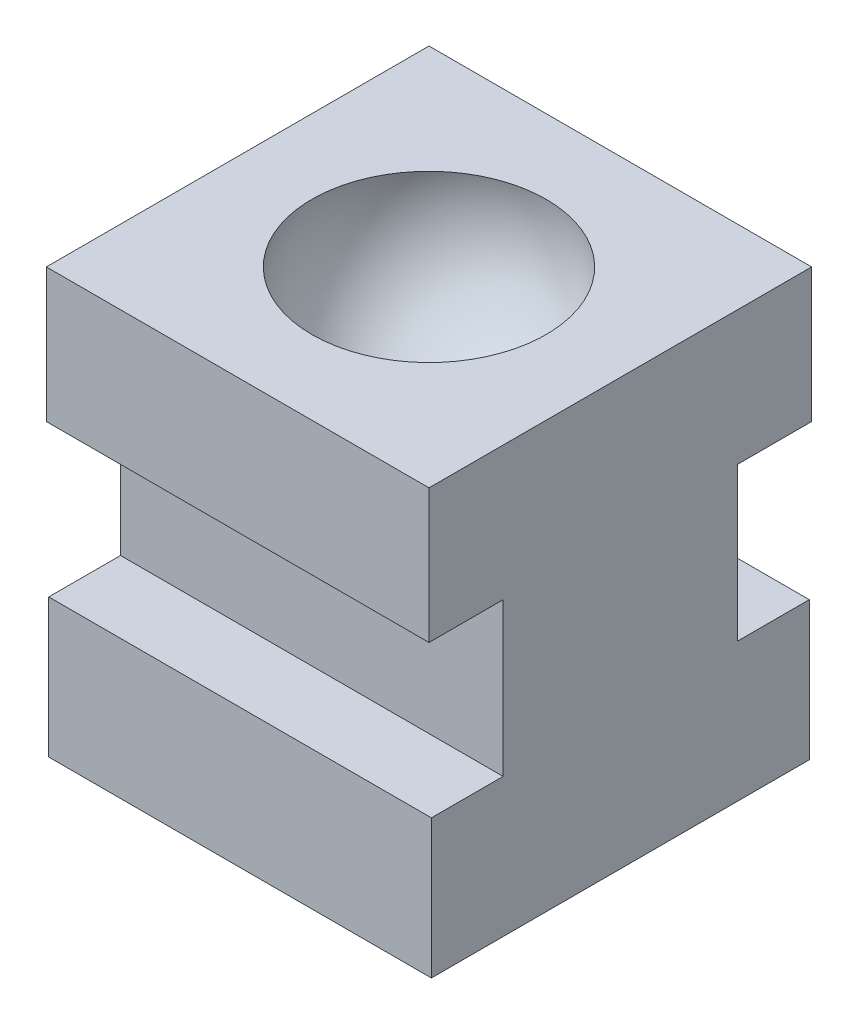
ISO-10303-21;
HEADER;
FILE_DESCRIPTION(('STEP AP214'),'2;1');
FILE_NAME('part.step','',(''),(''),'','','');
FILE_SCHEMA(('AUTOMOTIVE_DESIGN { 1 0 10303 214 1 1 1 1 }'));
ENDSEC;
DATA;
#1=APPLICATION_CONTEXT('core data for automotive mechanical design processes');
#2=APPLICATION_PROTOCOL_DEFINITION('international standard','automotive_design',2000,#1);
#3=PRODUCT_CONTEXT('',#1,'mechanical');
#4=PRODUCT('Part','Part','',(#3));
#5=PRODUCT_RELATED_PRODUCT_CATEGORY('part','',(#4));
#6=PRODUCT_DEFINITION_FORMATION('','',#4);
#7=PRODUCT_DEFINITION_CONTEXT('part definition',#1,'design');
#8=PRODUCT_DEFINITION('design','',#6,#7);
#9=PRODUCT_DEFINITION_SHAPE('','',#8);
#10=(LENGTH_UNIT() NAMED_UNIT(*) SI_UNIT(.MILLI.,.METRE.));
#11=(NAMED_UNIT(*) PLANE_ANGLE_UNIT() SI_UNIT($,.RADIAN.));
#12=(NAMED_UNIT(*) SI_UNIT($,.STERADIAN.) SOLID_ANGLE_UNIT());
#13=UNCERTAINTY_MEASURE_WITH_UNIT(LENGTH_MEASURE(1.E-05),#10,'distance_accuracy_value','');
#14=(GEOMETRIC_REPRESENTATION_CONTEXT(3) GLOBAL_UNCERTAINTY_ASSIGNED_CONTEXT((#13)) GLOBAL_UNIT_ASSIGNED_CONTEXT((#10,
#11,#12)) REPRESENTATION_CONTEXT('',''));
#15=CARTESIAN_POINT('',(0.,0.,0.));
#16=DIRECTION('',(0.,0.,1.));
#17=DIRECTION('',(1.,0.,0.));
#18=AXIS2_PLACEMENT_3D('',#15,#16,#17);
#19=CARTESIAN_POINT('',(0.,2.9,0.));
#20=DIRECTION('',(0.,-1.,0.));
#21=DIRECTION('',(0.,0.,-1.));
#22=AXIS2_PLACEMENT_3D('',#19,#20,#21);
#23=PLANE('',#22);
#24=DIRECTION('',(-1.,0.,0.));
#25=VECTOR('',#24,1.);
#26=CARTESIAN_POINT('',(8.,2.9,-6.4));
#27=LINE('',#26,#25);
#28=CARTESIAN_POINT('',(8.,2.9,-6.4));
#29=VERTEX_POINT('',#28);
#30=CARTESIAN_POINT('',(0.,2.9,-6.4));
#31=VERTEX_POINT('',#30);
#32=EDGE_CURVE('E170',#29,#31,#27,.T.);
#33=ORIENTED_EDGE('',*,*,#32,.F.);
#34=DIRECTION('',(0.,0.,-1.));
#35=VECTOR('',#34,1.);
#36=CARTESIAN_POINT('',(8.,2.9,0.));
#37=LINE('',#36,#35);
#38=CARTESIAN_POINT('',(8.,2.9,-7.9));
#39=VERTEX_POINT('',#38);
#40=EDGE_CURVE('E188',#29,#39,#37,.T.);
#41=ORIENTED_EDGE('',*,*,#40,.T.);
#42=DIRECTION('',(-1.,0.,0.));
#43=VECTOR('',#42,1.);
#44=CARTESIAN_POINT('',(0.,2.9,-7.9));
#45=LINE('',#44,#43);
#46=CARTESIAN_POINT('',(0.,2.9,-7.9));
#47=VERTEX_POINT('',#46);
#48=EDGE_CURVE('E192',#39,#47,#45,.T.);
#49=ORIENTED_EDGE('',*,*,#48,.T.);
#50=DIRECTION('',(0.,0.,1.));
#51=VECTOR('',#50,1.);
#52=CARTESIAN_POINT('',(0.,2.9,0.));
#53=LINE('',#52,#51);
#54=EDGE_CURVE('E182',#47,#31,#53,.T.);
#55=ORIENTED_EDGE('',*,*,#54,.T.);
#56=EDGE_LOOP('',(#33,#41,#49,#55));
#57=FACE_BOUND('',#56,.T.);
#58=ADVANCED_FACE('F33',(#57),#23,.F.);
#59=DIRECTION('',(1.,0.,0.));
#60=VECTOR('',#59,1.);
#61=CARTESIAN_POINT('',(8.,2.9,-1.5));
#62=LINE('',#61,#60);
#63=CARTESIAN_POINT('',(0.,2.9,-1.5));
#64=VERTEX_POINT('',#63);
#65=CARTESIAN_POINT('',(8.,2.9,-1.5));
#66=VERTEX_POINT('',#65);
#67=EDGE_CURVE('E166',#64,#66,#62,.T.);
#68=ORIENTED_EDGE('',*,*,#67,.F.);
#69=CARTESIAN_POINT('',(0.,2.9,0.));
#70=VERTEX_POINT('',#69);
#71=EDGE_CURVE('E186',#64,#70,#53,.T.);
#72=ORIENTED_EDGE('',*,*,#71,.T.);
#73=DIRECTION('',(1.,0.,0.));
#74=VECTOR('',#73,1.);
#75=CARTESIAN_POINT('',(0.,2.9,0.));
#76=LINE('',#75,#74);
#77=CARTESIAN_POINT('',(8.,2.9,0.));
#78=VERTEX_POINT('',#77);
#79=EDGE_CURVE('E185',#70,#78,#76,.T.);
#80=ORIENTED_EDGE('',*,*,#79,.T.);
#81=EDGE_CURVE('E189',#78,#66,#37,.T.);
#82=ORIENTED_EDGE('',*,*,#81,.T.);
#83=EDGE_LOOP('',(#68,#72,#80,#82));
#84=FACE_BOUND('',#83,.T.);
#85=ADVANCED_FACE('F246',(#84),#23,.F.);
#86=CARTESIAN_POINT('',(0.,2.9,0.));
#87=DIRECTION('',(1.,0.,0.));
#88=DIRECTION('',(0.,0.,-1.));
#89=AXIS2_PLACEMENT_3D('',#86,#87,#88);
#90=PLANE('',#89);
#91=DIRECTION('',(0.,-1.,0.));
#92=VECTOR('',#91,1.);
#93=CARTESIAN_POINT('',(0.,8.9,-1.5));
#94=LINE('',#93,#92);
#95=CARTESIAN_POINT('',(0.,6.1,-1.5));
#96=VERTEX_POINT('',#95);
#97=EDGE_CURVE('E179',#96,#64,#94,.T.);
#98=ORIENTED_EDGE('',*,*,#97,.F.);
#99=DIRECTION('',(0.,0.,1.));
#100=VECTOR('',#99,1.);
#101=CARTESIAN_POINT('',(0.,6.1,0.0500000000000002));
#102=LINE('',#101,#100);
#103=CARTESIAN_POINT('',(0.,6.1,0.0500000000000002));
#104=VERTEX_POINT('',#103);
#105=EDGE_CURVE('E156',#96,#104,#102,.T.);
#106=ORIENTED_EDGE('',*,*,#105,.T.);
#107=DIRECTION('',(0.,1.,0.));
#108=VECTOR('',#107,1.);
#109=CARTESIAN_POINT('',(0.,6.1,0.0500000000000002));
#110=LINE('',#109,#108);
#111=CARTESIAN_POINT('',(0.,8.9,0.0500000000000002));
#112=VERTEX_POINT('',#111);
#113=EDGE_CURVE('E145',#104,#112,#110,.T.);
#114=ORIENTED_EDGE('',*,*,#113,.T.);
#115=DIRECTION('',(0.,0.,1.));
#116=VECTOR('',#115,1.);
#117=CARTESIAN_POINT('',(0.,8.9,-6.4));
#118=LINE('',#117,#116);
#119=CARTESIAN_POINT('',(0.,8.9,-7.95));
#120=VERTEX_POINT('',#119);
#121=EDGE_CURVE('E167',#120,#112,#118,.T.);
#122=ORIENTED_EDGE('',*,*,#121,.F.);
#123=DIRECTION('',(0.,-1.,0.));
#124=VECTOR('',#123,1.);
#125=CARTESIAN_POINT('',(0.,6.1,-7.95));
#126=LINE('',#125,#124);
#127=CARTESIAN_POINT('',(0.,6.1,-7.95));
#128=VERTEX_POINT('',#127);
#129=EDGE_CURVE('E154',#120,#128,#126,.T.);
#130=ORIENTED_EDGE('',*,*,#129,.T.);
#131=CARTESIAN_POINT('',(0.,6.1,-6.4));
#132=VERTEX_POINT('',#131);
#133=EDGE_CURVE('E56',#128,#132,#102,.T.);
#134=ORIENTED_EDGE('',*,*,#133,.T.);
#135=DIRECTION('',(0.,-1.,0.));
#136=VECTOR('',#135,1.);
#137=CARTESIAN_POINT('',(0.,8.9,-6.4));
#138=LINE('',#137,#136);
#139=EDGE_CURVE('E172',#132,#31,#138,.T.);
#140=ORIENTED_EDGE('',*,*,#139,.T.);
#141=ORIENTED_EDGE('',*,*,#54,.F.);
#142=DIRECTION('',(0.,-1.,0.));
#143=VECTOR('',#142,1.);
#144=CARTESIAN_POINT('',(0.,2.9,-7.9));
#145=LINE('',#144,#143);
#146=CARTESIAN_POINT('',(0.,0.,-7.9));
#147=VERTEX_POINT('',#146);
#148=EDGE_CURVE('E194',#47,#147,#145,.T.);
#149=ORIENTED_EDGE('',*,*,#148,.T.);
#150=DIRECTION('',(0.,0.,1.));
#151=VECTOR('',#150,1.);
#152=CARTESIAN_POINT('',(0.,0.,0.));
#153=LINE('',#152,#151);
#154=CARTESIAN_POINT('',(0.,0.,0.));
#155=VERTEX_POINT('',#154);
#156=EDGE_CURVE('E181',#147,#155,#153,.T.);
#157=ORIENTED_EDGE('',*,*,#156,.T.);
#158=DIRECTION('',(0.,-1.,0.));
#159=VECTOR('',#158,1.);
#160=CARTESIAN_POINT('',(0.,2.9,0.));
#161=LINE('',#160,#159);
#162=EDGE_CURVE('E41',#70,#155,#161,.T.);
#163=ORIENTED_EDGE('',*,*,#162,.F.);
#164=ORIENTED_EDGE('',*,*,#71,.F.);
#165=EDGE_LOOP('',(#98,#106,#114,#122,#130,#134,#140,#141,#149,#157,#163,#164));
#166=FACE_BOUND('',#165,.T.);
#167=ADVANCED_FACE('F35',(#166),#90,.F.);
#168=CARTESIAN_POINT('',(0.,2.9,0.));
#169=DIRECTION('',(0.,0.,-1.));
#170=DIRECTION('',(-1.,0.,0.));
#171=AXIS2_PLACEMENT_3D('',#168,#169,#170);
#172=PLANE('',#171);
#173=DIRECTION('',(1.,0.,0.));
#174=VECTOR('',#173,1.);
#175=CARTESIAN_POINT('',(0.,0.,0.));
#176=LINE('',#175,#174);
#177=CARTESIAN_POINT('',(8.,0.,0.));
#178=VERTEX_POINT('',#177);
#179=EDGE_CURVE('E197',#155,#178,#176,.T.);
#180=ORIENTED_EDGE('',*,*,#179,.T.);
#181=DIRECTION('',(0.,-1.,0.));
#182=VECTOR('',#181,1.);
#183=CARTESIAN_POINT('',(8.,2.9,0.));
#184=LINE('',#183,#182);
#185=EDGE_CURVE('E208',#78,#178,#184,.T.);
#186=ORIENTED_EDGE('',*,*,#185,.F.);
#187=ORIENTED_EDGE('',*,*,#79,.F.);
#188=ORIENTED_EDGE('',*,*,#162,.T.);
#189=EDGE_LOOP('',(#180,#186,#187,#188));
#190=FACE_BOUND('',#189,.T.);
#191=ADVANCED_FACE('F214',(#190),#172,.F.);
#192=CARTESIAN_POINT('',(8.,2.9,0.));
#193=DIRECTION('',(-1.,0.,0.));
#194=DIRECTION('',(0.,0.,1.));
#195=AXIS2_PLACEMENT_3D('',#192,#193,#194);
#196=PLANE('',#195);
#197=DIRECTION('',(0.,-1.,0.));
#198=VECTOR('',#197,1.);
#199=CARTESIAN_POINT('',(8.,8.9,-6.4));
#200=LINE('',#199,#198);
#201=CARTESIAN_POINT('',(8.,6.1,-6.4));
#202=VERTEX_POINT('',#201);
#203=EDGE_CURVE('E138',#202,#29,#200,.T.);
#204=ORIENTED_EDGE('',*,*,#203,.F.);
#205=DIRECTION('',(0.,0.,1.));
#206=VECTOR('',#205,1.);
#207=CARTESIAN_POINT('',(8.,6.1,0.0500000000000002));
#208=LINE('',#207,#206);
#209=CARTESIAN_POINT('',(8.,6.1,-7.95));
#210=VERTEX_POINT('',#209);
#211=EDGE_CURVE('E125',#210,#202,#208,.T.);
#212=ORIENTED_EDGE('',*,*,#211,.F.);
#213=DIRECTION('',(0.,-1.,0.));
#214=VECTOR('',#213,1.);
#215=CARTESIAN_POINT('',(8.,6.1,-7.95));
#216=LINE('',#215,#214);
#217=CARTESIAN_POINT('',(8.,8.9,-7.95));
#218=VERTEX_POINT('',#217);
#219=EDGE_CURVE('E136',#218,#210,#216,.T.);
#220=ORIENTED_EDGE('',*,*,#219,.F.);
#221=DIRECTION('',(0.,0.,-1.));
#222=VECTOR('',#221,1.);
#223=CARTESIAN_POINT('',(8.,8.9,-6.4));
#224=LINE('',#223,#222);
#225=CARTESIAN_POINT('',(8.,8.9,0.0500000000000002));
#226=VERTEX_POINT('',#225);
#227=EDGE_CURVE('E169',#226,#218,#224,.T.);
#228=ORIENTED_EDGE('',*,*,#227,.F.);
#229=DIRECTION('',(0.,1.,0.));
#230=VECTOR('',#229,1.);
#231=CARTESIAN_POINT('',(8.,6.1,0.0500000000000002));
#232=LINE('',#231,#230);
#233=CARTESIAN_POINT('',(8.,6.1,0.0500000000000002));
#234=VERTEX_POINT('',#233);
#235=EDGE_CURVE('E130',#234,#226,#232,.T.);
#236=ORIENTED_EDGE('',*,*,#235,.F.);
#237=CARTESIAN_POINT('',(8.,6.1,-1.5));
#238=VERTEX_POINT('',#237);
#239=EDGE_CURVE('E139',#238,#234,#208,.T.);
#240=ORIENTED_EDGE('',*,*,#239,.F.);
#241=DIRECTION('',(0.,-1.,0.));
#242=VECTOR('',#241,1.);
#243=CARTESIAN_POINT('',(8.,8.9,-1.5));
#244=LINE('',#243,#242);
#245=EDGE_CURVE('E48',#238,#66,#244,.T.);
#246=ORIENTED_EDGE('',*,*,#245,.T.);
#247=ORIENTED_EDGE('',*,*,#81,.F.);
#248=ORIENTED_EDGE('',*,*,#185,.T.);
#249=DIRECTION('',(0.,0.,-1.));
#250=VECTOR('',#249,1.);
#251=CARTESIAN_POINT('',(8.,0.,0.));
#252=LINE('',#251,#250);
#253=CARTESIAN_POINT('',(8.,0.,-7.9));
#254=VERTEX_POINT('',#253);
#255=EDGE_CURVE('E199',#178,#254,#252,.T.);
#256=ORIENTED_EDGE('',*,*,#255,.T.);
#257=DIRECTION('',(0.,-1.,0.));
#258=VECTOR('',#257,1.);
#259=CARTESIAN_POINT('',(8.,2.9,-7.9));
#260=LINE('',#259,#258);
#261=EDGE_CURVE('E205',#39,#254,#260,.T.);
#262=ORIENTED_EDGE('',*,*,#261,.F.);
#263=ORIENTED_EDGE('',*,*,#40,.F.);
#264=EDGE_LOOP('',(#204,#212,#220,#228,#236,#240,#246,#247,#248,#256,#262,#263));
#265=FACE_BOUND('',#264,.T.);
#266=ADVANCED_FACE('F135',(#265),#196,.F.);
#267=CARTESIAN_POINT('',(0.,2.9,-7.9));
#268=DIRECTION('',(0.,0.,1.));
#269=DIRECTION('',(1.,0.,0.));
#270=AXIS2_PLACEMENT_3D('',#267,#268,#269);
#271=PLANE('',#270);
#272=DIRECTION('',(-1.,0.,0.));
#273=VECTOR('',#272,1.);
#274=CARTESIAN_POINT('',(0.,0.,-7.9));
#275=LINE('',#274,#273);
#276=EDGE_CURVE('E201',#254,#147,#275,.T.);
#277=ORIENTED_EDGE('',*,*,#276,.T.);
#278=ORIENTED_EDGE('',*,*,#148,.F.);
#279=ORIENTED_EDGE('',*,*,#48,.F.);
#280=ORIENTED_EDGE('',*,*,#261,.T.);
#281=EDGE_LOOP('',(#277,#278,#279,#280));
#282=FACE_BOUND('',#281,.T.);
#283=ADVANCED_FACE('F228',(#282),#271,.F.);
#284=CARTESIAN_POINT('',(0.,0.,0.));
#285=DIRECTION('',(0.,-1.,0.));
#286=DIRECTION('',(0.,0.,-1.));
#287=AXIS2_PLACEMENT_3D('',#284,#285,#286);
#288=PLANE('',#287);
#289=ORIENTED_EDGE('',*,*,#156,.F.);
#290=ORIENTED_EDGE('',*,*,#276,.F.);
#291=ORIENTED_EDGE('',*,*,#255,.F.);
#292=ORIENTED_EDGE('',*,*,#179,.F.);
#293=EDGE_LOOP('',(#289,#290,#291,#292));
#294=FACE_BOUND('',#293,.T.);
#295=ADVANCED_FACE('F222',(#294),#288,.T.);
#296=CARTESIAN_POINT('',(8.,8.9,-1.5));
#297=DIRECTION('',(0.,0.,-1.));
#298=DIRECTION('',(-1.,0.,0.));
#299=AXIS2_PLACEMENT_3D('',#296,#297,#298);
#300=PLANE('',#299);
#301=ORIENTED_EDGE('',*,*,#245,.F.);
#302=DIRECTION('',(-1.,0.,0.));
#303=VECTOR('',#302,1.);
#304=CARTESIAN_POINT('',(8.,6.1,-1.5));
#305=LINE('',#304,#303);
#306=EDGE_CURVE('E159',#238,#96,#305,.T.);
#307=ORIENTED_EDGE('',*,*,#306,.T.);
#308=ORIENTED_EDGE('',*,*,#97,.T.);
#309=ORIENTED_EDGE('',*,*,#67,.T.);
#310=EDGE_LOOP('',(#301,#307,#308,#309));
#311=FACE_BOUND('',#310,.T.);
#312=ADVANCED_FACE('F236',(#311),#300,.F.);
#313=CARTESIAN_POINT('',(8.,8.9,-6.4));
#314=DIRECTION('',(0.,0.,1.));
#315=DIRECTION('',(1.,0.,0.));
#316=AXIS2_PLACEMENT_3D('',#313,#314,#315);
#317=PLANE('',#316);
#318=ORIENTED_EDGE('',*,*,#139,.F.);
#319=DIRECTION('',(1.,0.,0.));
#320=VECTOR('',#319,1.);
#321=CARTESIAN_POINT('',(8.,6.1,-6.4));
#322=LINE('',#321,#320);
#323=EDGE_CURVE('E11',#132,#202,#322,.T.);
#324=ORIENTED_EDGE('',*,*,#323,.T.);
#325=ORIENTED_EDGE('',*,*,#203,.T.);
#326=ORIENTED_EDGE('',*,*,#32,.T.);
#327=EDGE_LOOP('',(#318,#324,#325,#326));
#328=FACE_BOUND('',#327,.T.);
#329=ADVANCED_FACE('F233',(#328),#317,.F.);
#330=CARTESIAN_POINT('',(0.,8.9,0.));
#331=DIRECTION('',(0.,-1.,0.));
#332=DIRECTION('',(0.,0.,-1.));
#333=AXIS2_PLACEMENT_3D('',#330,#331,#332);
#334=PLANE('',#333);
#335=CARTESIAN_POINT('',(4.,8.9,-3.95));
#336=DIRECTION('',(0.,1.,0.));
#337=DIRECTION('',(0.,0.,1.));
#338=AXIS2_PLACEMENT_3D('',#335,#336,#337);
#339=CIRCLE('',#338,2.44948974278318);
#340=CARTESIAN_POINT('',(4.,8.9,-1.50051025721682));
#341=VERTEX_POINT('',#340);
#342=EDGE_CURVE('E150',#341,#341,#339,.T.);
#343=ORIENTED_EDGE('',*,*,#342,.F.);
#344=EDGE_LOOP('',(#343));
#345=FACE_BOUND('',#344,.T.);
#346=ORIENTED_EDGE('',*,*,#121,.T.);
#347=DIRECTION('',(-1.,0.,0.));
#348=VECTOR('',#347,1.);
#349=CARTESIAN_POINT('',(8.,8.9,0.0500000000000002));
#350=LINE('',#349,#348);
#351=EDGE_CURVE('E160',#226,#112,#350,.T.);
#352=ORIENTED_EDGE('',*,*,#351,.F.);
#353=ORIENTED_EDGE('',*,*,#227,.T.);
#354=DIRECTION('',(-1.,0.,0.));
#355=VECTOR('',#354,1.);
#356=CARTESIAN_POINT('',(8.,8.9,-7.95));
#357=LINE('',#356,#355);
#358=EDGE_CURVE('E144',#218,#120,#357,.T.);
#359=ORIENTED_EDGE('',*,*,#358,.T.);
#360=EDGE_LOOP('',(#346,#352,#353,#359));
#361=FACE_BOUND('',#360,.T.);
#362=ADVANCED_FACE('F235',(#345,#361),#334,.F.);
#363=CARTESIAN_POINT('',(8.,6.1,-7.95));
#364=DIRECTION('',(0.,0.,-1.));
#365=DIRECTION('',(-1.,0.,0.));
#366=AXIS2_PLACEMENT_3D('',#363,#364,#365);
#367=PLANE('',#366);
#368=ORIENTED_EDGE('',*,*,#129,.F.);
#369=ORIENTED_EDGE('',*,*,#358,.F.);
#370=ORIENTED_EDGE('',*,*,#219,.T.);
#371=DIRECTION('',(-1.,0.,0.));
#372=VECTOR('',#371,1.);
#373=CARTESIAN_POINT('',(8.,6.1,-7.95));
#374=LINE('',#373,#372);
#375=EDGE_CURVE('E122',#210,#128,#374,.T.);
#376=ORIENTED_EDGE('',*,*,#375,.T.);
#377=EDGE_LOOP('',(#368,#369,#370,#376));
#378=FACE_BOUND('',#377,.T.);
#379=ADVANCED_FACE('F142',(#378),#367,.T.);
#380=CARTESIAN_POINT('',(8.,6.1,0.0500000000000002));
#381=DIRECTION('',(0.,-1.,0.));
#382=DIRECTION('',(0.,0.,-1.));
#383=AXIS2_PLACEMENT_3D('',#380,#381,#382);
#384=PLANE('',#383);
#385=ORIENTED_EDGE('',*,*,#323,.F.);
#386=ORIENTED_EDGE('',*,*,#133,.F.);
#387=ORIENTED_EDGE('',*,*,#375,.F.);
#388=ORIENTED_EDGE('',*,*,#211,.T.);
#389=EDGE_LOOP('',(#385,#386,#387,#388));
#390=FACE_BOUND('',#389,.T.);
#391=ADVANCED_FACE('F124',(#390),#384,.T.);
#392=ORIENTED_EDGE('',*,*,#306,.F.);
#393=ORIENTED_EDGE('',*,*,#239,.T.);
#394=DIRECTION('',(-1.,0.,0.));
#395=VECTOR('',#394,1.);
#396=CARTESIAN_POINT('',(8.,6.1,0.0500000000000002));
#397=LINE('',#396,#395);
#398=EDGE_CURVE('E129',#234,#104,#397,.T.);
#399=ORIENTED_EDGE('',*,*,#398,.T.);
#400=ORIENTED_EDGE('',*,*,#105,.F.);
#401=EDGE_LOOP('',(#392,#393,#399,#400));
#402=FACE_BOUND('',#401,.T.);
#403=ADVANCED_FACE('F342',(#402),#384,.T.);
#404=CARTESIAN_POINT('',(8.,6.1,0.0500000000000002));
#405=DIRECTION('',(0.,0.,1.));
#406=DIRECTION('',(1.,0.,0.));
#407=AXIS2_PLACEMENT_3D('',#404,#405,#406);
#408=PLANE('',#407);
#409=ORIENTED_EDGE('',*,*,#113,.F.);
#410=ORIENTED_EDGE('',*,*,#398,.F.);
#411=ORIENTED_EDGE('',*,*,#235,.T.);
#412=ORIENTED_EDGE('',*,*,#351,.T.);
#413=EDGE_LOOP('',(#409,#410,#411,#412));
#414=FACE_BOUND('',#413,.T.);
#415=ADVANCED_FACE('F350',(#414),#408,.T.);
#416=CARTESIAN_POINT('',(4.,8.4,-3.95));
#417=DIRECTION('',(0.,1.,0.));
#418=DIRECTION('',(0.,0.,-1.));
#419=AXIS2_PLACEMENT_3D('',#416,#417,#418);
#420=SPHERICAL_SURFACE('',#419,2.5);
#421=ORIENTED_EDGE('',*,*,#342,.T.);
#422=EDGE_LOOP('',(#421));
#423=FACE_BOUND('',#422,.T.);
#424=ADVANCED_FACE('F357',(#423),#420,.F.);
#425=CLOSED_SHELL('',(#58,#85,#167,#191,#266,#283,#295,#312,#329,#362,#379,#391,#403,#415,#424));
#426=MANIFOLD_SOLID_BREP('B2',#425);
#427=ADVANCED_BREP_SHAPE_REPRESENTATION('',(#18,#426),#14);
#428=SHAPE_DEFINITION_REPRESENTATION(#9,#427);
ENDSEC;
END-ISO-10303-21;
